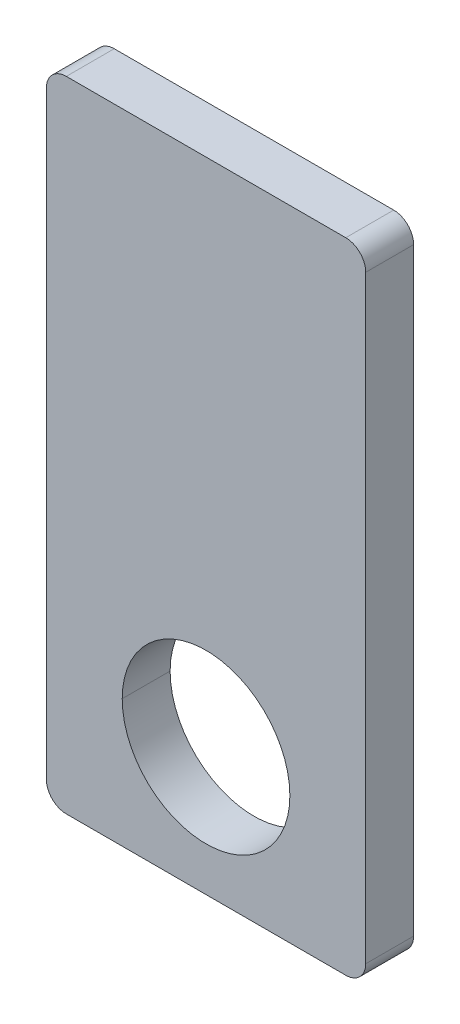
ISO-10303-21;
HEADER;
FILE_DESCRIPTION(('STEP AP214'),'2;1');
FILE_NAME('part.step','',(''),(''),'','','');
FILE_SCHEMA(('AUTOMOTIVE_DESIGN { 1 0 10303 214 1 1 1 1 }'));
ENDSEC;
DATA;
#1=APPLICATION_CONTEXT('core data for automotive mechanical design processes');
#2=APPLICATION_PROTOCOL_DEFINITION('international standard','automotive_design',2000,#1);
#3=PRODUCT_CONTEXT('',#1,'mechanical');
#4=PRODUCT('Part','Part','',(#3));
#5=PRODUCT_RELATED_PRODUCT_CATEGORY('part','',(#4));
#6=PRODUCT_DEFINITION_FORMATION('','',#4);
#7=PRODUCT_DEFINITION_CONTEXT('part definition',#1,'design');
#8=PRODUCT_DEFINITION('design','',#6,#7);
#9=PRODUCT_DEFINITION_SHAPE('','',#8);
#10=(LENGTH_UNIT() NAMED_UNIT(*) SI_UNIT(.MILLI.,.METRE.));
#11=(NAMED_UNIT(*) PLANE_ANGLE_UNIT() SI_UNIT($,.RADIAN.));
#12=(NAMED_UNIT(*) SI_UNIT($,.STERADIAN.) SOLID_ANGLE_UNIT());
#13=UNCERTAINTY_MEASURE_WITH_UNIT(LENGTH_MEASURE(1.E-05),#10,'distance_accuracy_value','');
#14=(GEOMETRIC_REPRESENTATION_CONTEXT(3) GLOBAL_UNCERTAINTY_ASSIGNED_CONTEXT((#13)) GLOBAL_UNIT_ASSIGNED_CONTEXT((#10,
#11,#12)) REPRESENTATION_CONTEXT('',''));
#15=CARTESIAN_POINT('',(0.,0.,0.));
#16=DIRECTION('',(0.,0.,1.));
#17=DIRECTION('',(1.,0.,0.));
#18=AXIS2_PLACEMENT_3D('',#15,#16,#17);
#19=CARTESIAN_POINT('',(35.,75.,12.));
#20=DIRECTION('',(0.,0.,-1.));
#21=DIRECTION('',(-1.,0.,0.));
#22=AXIS2_PLACEMENT_3D('',#19,#20,#21);
#23=CYLINDRICAL_SURFACE('',#22,5.);
#24=CARTESIAN_POINT('',(35.,75.,12.));
#25=DIRECTION('',(0.,0.,1.));
#26=DIRECTION('',(1.,0.,0.));
#27=AXIS2_PLACEMENT_3D('',#24,#25,#26);
#28=CIRCLE('',#27,5.);
#29=CARTESIAN_POINT('',(40.,75.,12.));
#30=VERTEX_POINT('',#29);
#31=CARTESIAN_POINT('',(35.,80.,12.));
#32=VERTEX_POINT('',#31);
#33=EDGE_CURVE('E101',#30,#32,#28,.T.);
#34=ORIENTED_EDGE('',*,*,#33,.F.);
#35=DIRECTION('',(0.,0.,1.));
#36=VECTOR('',#35,1.);
#37=CARTESIAN_POINT('',(40.,75.,12.));
#38=LINE('',#37,#36);
#39=CARTESIAN_POINT('',(40.,75.,0.));
#40=VERTEX_POINT('',#39);
#41=EDGE_CURVE('E171',#40,#30,#38,.T.);
#42=ORIENTED_EDGE('',*,*,#41,.F.);
#43=CARTESIAN_POINT('',(35.,75.,0.));
#44=DIRECTION('',(0.,0.,-1.));
#45=DIRECTION('',(1.,0.,0.));
#46=AXIS2_PLACEMENT_3D('',#43,#44,#45);
#47=CIRCLE('',#46,5.);
#48=CARTESIAN_POINT('',(35.,80.,0.));
#49=VERTEX_POINT('',#48);
#50=EDGE_CURVE('E28',#49,#40,#47,.T.);
#51=ORIENTED_EDGE('',*,*,#50,.F.);
#52=DIRECTION('',(0.,0.,-1.));
#53=VECTOR('',#52,1.);
#54=CARTESIAN_POINT('',(35.,80.,12.));
#55=LINE('',#54,#53);
#56=EDGE_CURVE('E118',#32,#49,#55,.T.);
#57=ORIENTED_EDGE('',*,*,#56,.F.);
#58=EDGE_LOOP('',(#34,#42,#51,#57));
#59=FACE_BOUND('',#58,.T.);
#60=ADVANCED_FACE('F17',(#59),#23,.T.);
#61=CARTESIAN_POINT('',(-35.,75.,12.));
#62=DIRECTION('',(0.,0.,-1.));
#63=DIRECTION('',(-1.,0.,0.));
#64=AXIS2_PLACEMENT_3D('',#61,#62,#63);
#65=CYLINDRICAL_SURFACE('',#64,5.);
#66=CARTESIAN_POINT('',(-35.,75.,12.));
#67=DIRECTION('',(0.,0.,1.));
#68=DIRECTION('',(1.,0.,0.));
#69=AXIS2_PLACEMENT_3D('',#66,#67,#68);
#70=CIRCLE('',#69,5.);
#71=CARTESIAN_POINT('',(-35.,80.,12.));
#72=VERTEX_POINT('',#71);
#73=CARTESIAN_POINT('',(-40.,75.,12.));
#74=VERTEX_POINT('',#73);
#75=EDGE_CURVE('E113',#72,#74,#70,.T.);
#76=ORIENTED_EDGE('',*,*,#75,.F.);
#77=DIRECTION('',(0.,0.,1.));
#78=VECTOR('',#77,1.);
#79=CARTESIAN_POINT('',(-35.,80.,12.));
#80=LINE('',#79,#78);
#81=CARTESIAN_POINT('',(-35.,80.,0.));
#82=VERTEX_POINT('',#81);
#83=EDGE_CURVE('E128',#82,#72,#80,.T.);
#84=ORIENTED_EDGE('',*,*,#83,.F.);
#85=CARTESIAN_POINT('',(-35.,75.,0.));
#86=DIRECTION('',(0.,0.,-1.));
#87=DIRECTION('',(1.,0.,0.));
#88=AXIS2_PLACEMENT_3D('',#85,#86,#87);
#89=CIRCLE('',#88,5.);
#90=CARTESIAN_POINT('',(-40.,75.,0.));
#91=VERTEX_POINT('',#90);
#92=EDGE_CURVE('E173',#91,#82,#89,.T.);
#93=ORIENTED_EDGE('',*,*,#92,.F.);
#94=DIRECTION('',(0.,0.,-1.));
#95=VECTOR('',#94,1.);
#96=CARTESIAN_POINT('',(-40.,75.,12.));
#97=LINE('',#96,#95);
#98=EDGE_CURVE('E21',#74,#91,#97,.T.);
#99=ORIENTED_EDGE('',*,*,#98,.F.);
#100=EDGE_LOOP('',(#76,#84,#93,#99));
#101=FACE_BOUND('',#100,.T.);
#102=ADVANCED_FACE('F269',(#101),#65,.T.);
#103=CARTESIAN_POINT('',(-35.,-75.,12.));
#104=DIRECTION('',(0.,0.,-1.));
#105=DIRECTION('',(-1.,0.,0.));
#106=AXIS2_PLACEMENT_3D('',#103,#104,#105);
#107=CYLINDRICAL_SURFACE('',#106,5.);
#108=CARTESIAN_POINT('',(-35.,-75.,12.));
#109=DIRECTION('',(0.,0.,1.));
#110=DIRECTION('',(1.,0.,0.));
#111=AXIS2_PLACEMENT_3D('',#108,#109,#110);
#112=CIRCLE('',#111,5.);
#113=CARTESIAN_POINT('',(-40.,-75.,12.));
#114=VERTEX_POINT('',#113);
#115=CARTESIAN_POINT('',(-35.,-80.,12.));
#116=VERTEX_POINT('',#115);
#117=EDGE_CURVE('E43',#114,#116,#112,.T.);
#118=ORIENTED_EDGE('',*,*,#117,.F.);
#119=DIRECTION('',(0.,0.,1.));
#120=VECTOR('',#119,1.);
#121=CARTESIAN_POINT('',(-40.,-75.,12.));
#122=LINE('',#121,#120);
#123=CARTESIAN_POINT('',(-40.,-75.,0.));
#124=VERTEX_POINT('',#123);
#125=EDGE_CURVE('E206',#124,#114,#122,.T.);
#126=ORIENTED_EDGE('',*,*,#125,.F.);
#127=CARTESIAN_POINT('',(-35.,-75.,0.));
#128=DIRECTION('',(0.,0.,-1.));
#129=DIRECTION('',(1.,0.,0.));
#130=AXIS2_PLACEMENT_3D('',#127,#128,#129);
#131=CIRCLE('',#130,5.);
#132=CARTESIAN_POINT('',(-35.,-80.,0.));
#133=VERTEX_POINT('',#132);
#134=EDGE_CURVE('E176',#133,#124,#131,.T.);
#135=ORIENTED_EDGE('',*,*,#134,.F.);
#136=DIRECTION('',(0.,0.,-1.));
#137=VECTOR('',#136,1.);
#138=CARTESIAN_POINT('',(-35.,-80.,12.));
#139=LINE('',#138,#137);
#140=EDGE_CURVE('E143',#116,#133,#139,.T.);
#141=ORIENTED_EDGE('',*,*,#140,.F.);
#142=EDGE_LOOP('',(#118,#126,#135,#141));
#143=FACE_BOUND('',#142,.T.);
#144=ADVANCED_FACE('F274',(#143),#107,.T.);
#145=CARTESIAN_POINT('',(35.,-75.,12.));
#146=DIRECTION('',(0.,0.,-1.));
#147=DIRECTION('',(-1.,0.,0.));
#148=AXIS2_PLACEMENT_3D('',#145,#146,#147);
#149=CYLINDRICAL_SURFACE('',#148,5.);
#150=CARTESIAN_POINT('',(35.,-75.,12.));
#151=DIRECTION('',(0.,0.,1.));
#152=DIRECTION('',(1.,0.,0.));
#153=AXIS2_PLACEMENT_3D('',#150,#151,#152);
#154=CIRCLE('',#153,5.);
#155=CARTESIAN_POINT('',(35.,-80.,12.));
#156=VERTEX_POINT('',#155);
#157=CARTESIAN_POINT('',(40.,-75.,12.));
#158=VERTEX_POINT('',#157);
#159=EDGE_CURVE('E114',#156,#158,#154,.T.);
#160=ORIENTED_EDGE('',*,*,#159,.F.);
#161=DIRECTION('',(0.,0.,1.));
#162=VECTOR('',#161,1.);
#163=CARTESIAN_POINT('',(35.,-80.,12.));
#164=LINE('',#163,#162);
#165=CARTESIAN_POINT('',(35.,-80.,0.));
#166=VERTEX_POINT('',#165);
#167=EDGE_CURVE('E144',#166,#156,#164,.T.);
#168=ORIENTED_EDGE('',*,*,#167,.F.);
#169=CARTESIAN_POINT('',(35.,-75.,0.));
#170=DIRECTION('',(0.,0.,-1.));
#171=DIRECTION('',(1.,0.,0.));
#172=AXIS2_PLACEMENT_3D('',#169,#170,#171);
#173=CIRCLE('',#172,5.);
#174=CARTESIAN_POINT('',(40.,-75.,0.));
#175=VERTEX_POINT('',#174);
#176=EDGE_CURVE('E147',#175,#166,#173,.T.);
#177=ORIENTED_EDGE('',*,*,#176,.F.);
#178=DIRECTION('',(0.,0.,-1.));
#179=VECTOR('',#178,1.);
#180=CARTESIAN_POINT('',(40.,-75.,12.));
#181=LINE('',#180,#179);
#182=EDGE_CURVE('E172',#158,#175,#181,.T.);
#183=ORIENTED_EDGE('',*,*,#182,.F.);
#184=EDGE_LOOP('',(#160,#168,#177,#183));
#185=FACE_BOUND('',#184,.T.);
#186=ADVANCED_FACE('F252',(#185),#149,.T.);
#187=CARTESIAN_POINT('',(0.,-48.,-82.));
#188=DIRECTION('',(0.,0.,1.));
#189=DIRECTION('',(1.,0.,0.));
#190=AXIS2_PLACEMENT_3D('',#187,#188,#189);
#191=CYLINDRICAL_SURFACE('',#190,21.);
#192=DIRECTION('',(0.,0.,1.));
#193=VECTOR('',#192,1.);
#194=CARTESIAN_POINT('',(-21.,-48.,-82.));
#195=LINE('',#194,#193);
#196=CARTESIAN_POINT('',(-21.,-48.,0.));
#197=VERTEX_POINT('',#196);
#198=CARTESIAN_POINT('',(-21.,-48.,12.));
#199=VERTEX_POINT('',#198);
#200=EDGE_CURVE('E202',#197,#199,#195,.T.);
#201=ORIENTED_EDGE('',*,*,#200,.F.);
#202=CARTESIAN_POINT('',(0.,-48.,0.));
#203=DIRECTION('',(0.,0.,1.));
#204=DIRECTION('',(1.,0.,0.));
#205=AXIS2_PLACEMENT_3D('',#202,#203,#204);
#206=CIRCLE('',#205,21.);
#207=CARTESIAN_POINT('',(21.,-48.,0.));
#208=VERTEX_POINT('',#207);
#209=EDGE_CURVE('E11',#208,#197,#206,.T.);
#210=ORIENTED_EDGE('',*,*,#209,.F.);
#211=DIRECTION('',(0.,0.,1.));
#212=VECTOR('',#211,1.);
#213=CARTESIAN_POINT('',(21.,-48.,-82.));
#214=LINE('',#213,#212);
#215=CARTESIAN_POINT('',(21.,-48.,12.));
#216=VERTEX_POINT('',#215);
#217=EDGE_CURVE('E190',#208,#216,#214,.T.);
#218=ORIENTED_EDGE('',*,*,#217,.T.);
#219=CARTESIAN_POINT('',(0.,-48.,12.));
#220=DIRECTION('',(0.,0.,1.));
#221=DIRECTION('',(1.,0.,0.));
#222=AXIS2_PLACEMENT_3D('',#219,#220,#221);
#223=CIRCLE('',#222,21.);
#224=EDGE_CURVE('E145',#216,#199,#223,.T.);
#225=ORIENTED_EDGE('',*,*,#224,.T.);
#226=EDGE_LOOP('',(#201,#210,#218,#225));
#227=FACE_BOUND('',#226,.T.);
#228=ADVANCED_FACE('F278',(#227),#191,.F.);
#229=CARTESIAN_POINT('',(0.,0.,0.));
#230=DIRECTION('',(0.,0.,1.));
#231=DIRECTION('',(1.,0.,0.));
#232=AXIS2_PLACEMENT_3D('',#229,#230,#231);
#233=PLANE('',#232);
#234=ORIENTED_EDGE('',*,*,#209,.T.);
#235=CARTESIAN_POINT('',(0.,-48.,0.));
#236=DIRECTION('',(0.,0.,1.));
#237=DIRECTION('',(1.,0.,0.));
#238=AXIS2_PLACEMENT_3D('',#235,#236,#237);
#239=CIRCLE('',#238,21.);
#240=EDGE_CURVE('E198',#197,#208,#239,.T.);
#241=ORIENTED_EDGE('',*,*,#240,.T.);
#242=EDGE_LOOP('',(#234,#241));
#243=FACE_BOUND('',#242,.T.);
#244=DIRECTION('',(0.,1.,0.));
#245=VECTOR('',#244,1.);
#246=CARTESIAN_POINT('',(40.,80.,0.));
#247=LINE('',#246,#245);
#248=EDGE_CURVE('E167',#175,#40,#247,.T.);
#249=ORIENTED_EDGE('',*,*,#248,.F.);
#250=ORIENTED_EDGE('',*,*,#176,.T.);
#251=DIRECTION('',(1.,0.,0.));
#252=VECTOR('',#251,1.);
#253=CARTESIAN_POINT('',(-40.,-80.,0.));
#254=LINE('',#253,#252);
#255=EDGE_CURVE('E150',#133,#166,#254,.T.);
#256=ORIENTED_EDGE('',*,*,#255,.F.);
#257=ORIENTED_EDGE('',*,*,#134,.T.);
#258=DIRECTION('',(0.,-1.,0.));
#259=VECTOR('',#258,1.);
#260=CARTESIAN_POINT('',(-40.,80.,0.));
#261=LINE('',#260,#259);
#262=EDGE_CURVE('E124',#91,#124,#261,.T.);
#263=ORIENTED_EDGE('',*,*,#262,.F.);
#264=ORIENTED_EDGE('',*,*,#92,.T.);
#265=DIRECTION('',(-1.,0.,0.));
#266=VECTOR('',#265,1.);
#267=CARTESIAN_POINT('',(-40.,80.,0.));
#268=LINE('',#267,#266);
#269=EDGE_CURVE('E135',#49,#82,#268,.T.);
#270=ORIENTED_EDGE('',*,*,#269,.F.);
#271=ORIENTED_EDGE('',*,*,#50,.T.);
#272=EDGE_LOOP('',(#249,#250,#256,#257,#263,#264,#270,#271));
#273=FACE_BOUND('',#272,.T.);
#274=ADVANCED_FACE('F225',(#243,#273),#233,.F.);
#275=CARTESIAN_POINT('',(0.,0.,12.));
#276=DIRECTION('',(0.,0.,1.));
#277=DIRECTION('',(1.,0.,0.));
#278=AXIS2_PLACEMENT_3D('',#275,#276,#277);
#279=PLANE('',#278);
#280=ORIENTED_EDGE('',*,*,#224,.F.);
#281=CARTESIAN_POINT('',(0.,-48.,12.));
#282=DIRECTION('',(0.,0.,1.));
#283=DIRECTION('',(1.,0.,0.));
#284=AXIS2_PLACEMENT_3D('',#281,#282,#283);
#285=CIRCLE('',#284,21.);
#286=EDGE_CURVE('E197',#199,#216,#285,.T.);
#287=ORIENTED_EDGE('',*,*,#286,.F.);
#288=EDGE_LOOP('',(#280,#287));
#289=FACE_BOUND('',#288,.T.);
#290=DIRECTION('',(1.,0.,0.));
#291=VECTOR('',#290,1.);
#292=CARTESIAN_POINT('',(-40.,-80.,12.));
#293=LINE('',#292,#291);
#294=EDGE_CURVE('E140',#116,#156,#293,.T.);
#295=ORIENTED_EDGE('',*,*,#294,.T.);
#296=ORIENTED_EDGE('',*,*,#159,.T.);
#297=DIRECTION('',(0.,1.,0.));
#298=VECTOR('',#297,1.);
#299=CARTESIAN_POINT('',(40.,80.,12.));
#300=LINE('',#299,#298);
#301=EDGE_CURVE('E108',#158,#30,#300,.T.);
#302=ORIENTED_EDGE('',*,*,#301,.T.);
#303=ORIENTED_EDGE('',*,*,#33,.T.);
#304=DIRECTION('',(-1.,0.,0.));
#305=VECTOR('',#304,1.);
#306=CARTESIAN_POINT('',(-40.,80.,12.));
#307=LINE('',#306,#305);
#308=EDGE_CURVE('E105',#32,#72,#307,.T.);
#309=ORIENTED_EDGE('',*,*,#308,.T.);
#310=ORIENTED_EDGE('',*,*,#75,.T.);
#311=DIRECTION('',(0.,-1.,0.));
#312=VECTOR('',#311,1.);
#313=CARTESIAN_POINT('',(-40.,80.,12.));
#314=LINE('',#313,#312);
#315=EDGE_CURVE('E165',#74,#114,#314,.T.);
#316=ORIENTED_EDGE('',*,*,#315,.T.);
#317=ORIENTED_EDGE('',*,*,#117,.T.);
#318=EDGE_LOOP('',(#295,#296,#302,#303,#309,#310,#316,#317));
#319=FACE_BOUND('',#318,.T.);
#320=ADVANCED_FACE('F103',(#289,#319),#279,.T.);
#321=CARTESIAN_POINT('',(-40.,-80.,12.));
#322=DIRECTION('',(0.,1.,0.));
#323=DIRECTION('',(1.,0.,0.));
#324=AXIS2_PLACEMENT_3D('',#321,#322,#323);
#325=PLANE('',#324);
#326=ORIENTED_EDGE('',*,*,#255,.T.);
#327=ORIENTED_EDGE('',*,*,#167,.T.);
#328=ORIENTED_EDGE('',*,*,#294,.F.);
#329=ORIENTED_EDGE('',*,*,#140,.T.);
#330=EDGE_LOOP('',(#326,#327,#328,#329));
#331=FACE_BOUND('',#330,.T.);
#332=ADVANCED_FACE('F19',(#331),#325,.F.);
#333=CARTESIAN_POINT('',(-40.,80.,12.));
#334=DIRECTION('',(1.,0.,0.));
#335=DIRECTION('',(0.,1.,0.));
#336=AXIS2_PLACEMENT_3D('',#333,#334,#335);
#337=PLANE('',#336);
#338=ORIENTED_EDGE('',*,*,#262,.T.);
#339=ORIENTED_EDGE('',*,*,#125,.T.);
#340=ORIENTED_EDGE('',*,*,#315,.F.);
#341=ORIENTED_EDGE('',*,*,#98,.T.);
#342=EDGE_LOOP('',(#338,#339,#340,#341));
#343=FACE_BOUND('',#342,.T.);
#344=ADVANCED_FACE('F265',(#343),#337,.F.);
#345=CARTESIAN_POINT('',(-40.,80.,12.));
#346=DIRECTION('',(0.,-1.,0.));
#347=DIRECTION('',(0.,0.,-1.));
#348=AXIS2_PLACEMENT_3D('',#345,#346,#347);
#349=PLANE('',#348);
#350=ORIENTED_EDGE('',*,*,#269,.T.);
#351=ORIENTED_EDGE('',*,*,#83,.T.);
#352=ORIENTED_EDGE('',*,*,#308,.F.);
#353=ORIENTED_EDGE('',*,*,#56,.T.);
#354=EDGE_LOOP('',(#350,#351,#352,#353));
#355=FACE_BOUND('',#354,.T.);
#356=ADVANCED_FACE('F126',(#355),#349,.F.);
#357=CARTESIAN_POINT('',(40.,80.,12.));
#358=DIRECTION('',(-1.,0.,0.));
#359=DIRECTION('',(0.,0.,1.));
#360=AXIS2_PLACEMENT_3D('',#357,#358,#359);
#361=PLANE('',#360);
#362=ORIENTED_EDGE('',*,*,#301,.F.);
#363=ORIENTED_EDGE('',*,*,#182,.T.);
#364=ORIENTED_EDGE('',*,*,#248,.T.);
#365=ORIENTED_EDGE('',*,*,#41,.T.);
#366=EDGE_LOOP('',(#362,#363,#364,#365));
#367=FACE_BOUND('',#366,.T.);
#368=ADVANCED_FACE('F254',(#367),#361,.F.);
#369=CARTESIAN_POINT('',(0.,-48.,-82.));
#370=DIRECTION('',(0.,0.,1.));
#371=DIRECTION('',(1.,0.,0.));
#372=AXIS2_PLACEMENT_3D('',#369,#370,#371);
#373=CYLINDRICAL_SURFACE('',#372,21.);
#374=ORIENTED_EDGE('',*,*,#240,.F.);
#375=ORIENTED_EDGE('',*,*,#200,.T.);
#376=ORIENTED_EDGE('',*,*,#286,.T.);
#377=ORIENTED_EDGE('',*,*,#217,.F.);
#378=EDGE_LOOP('',(#374,#375,#376,#377));
#379=FACE_BOUND('',#378,.T.);
#380=ADVANCED_FACE('F256',(#379),#373,.F.);
#381=CLOSED_SHELL('',(#60,#102,#144,#186,#228,#274,#320,#332,#344,#356,#368,#380));
#382=MANIFOLD_SOLID_BREP('B1',#381);
#383=ADVANCED_BREP_SHAPE_REPRESENTATION('',(#18,#382),#14);
#384=SHAPE_DEFINITION_REPRESENTATION(#9,#383);
ENDSEC;
END-ISO-10303-21;
